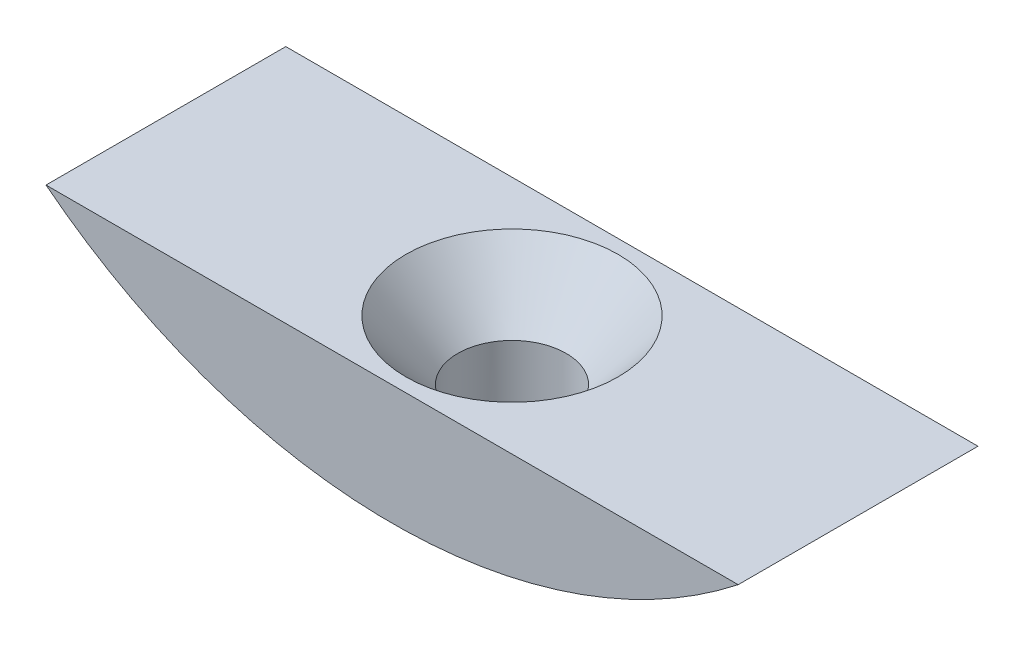
ISO-10303-21;
HEADER;
FILE_DESCRIPTION(('STEP AP214'),'2;1');
FILE_NAME('part.step','',(''),(''),'','','');
FILE_SCHEMA(('AUTOMOTIVE_DESIGN { 1 0 10303 214 1 1 1 1 }'));
ENDSEC;
DATA;
#1=APPLICATION_CONTEXT('core data for automotive mechanical design processes');
#2=APPLICATION_PROTOCOL_DEFINITION('international standard','automotive_design',2000,#1);
#3=PRODUCT_CONTEXT('',#1,'mechanical');
#4=PRODUCT('Part','Part','',(#3));
#5=PRODUCT_RELATED_PRODUCT_CATEGORY('part','',(#4));
#6=PRODUCT_DEFINITION_FORMATION('','',#4);
#7=PRODUCT_DEFINITION_CONTEXT('part definition',#1,'design');
#8=PRODUCT_DEFINITION('design','',#6,#7);
#9=PRODUCT_DEFINITION_SHAPE('','',#8);
#10=(LENGTH_UNIT() NAMED_UNIT(*) SI_UNIT(.MILLI.,.METRE.));
#11=(NAMED_UNIT(*) PLANE_ANGLE_UNIT() SI_UNIT($,.RADIAN.));
#12=(NAMED_UNIT(*) SI_UNIT($,.STERADIAN.) SOLID_ANGLE_UNIT());
#13=UNCERTAINTY_MEASURE_WITH_UNIT(LENGTH_MEASURE(1.E-05),#10,'distance_accuracy_value','');
#14=(GEOMETRIC_REPRESENTATION_CONTEXT(3) GLOBAL_UNCERTAINTY_ASSIGNED_CONTEXT((#13)) GLOBAL_UNIT_ASSIGNED_CONTEXT((#10,
#11,#12)) REPRESENTATION_CONTEXT('',''));
#15=CARTESIAN_POINT('',(0.,0.,0.));
#16=DIRECTION('',(0.,0.,1.));
#17=DIRECTION('',(1.,0.,0.));
#18=AXIS2_PLACEMENT_3D('',#15,#16,#17);
#19=CARTESIAN_POINT('',(0.,17.4625,-9.525));
#20=DIRECTION('',(0.,0.,1.));
#21=DIRECTION('',(1.,0.,0.));
#22=AXIS2_PLACEMENT_3D('',#19,#20,#21);
#23=CYLINDRICAL_SURFACE('',#22,22.225);
#24=CARTESIAN_POINT('',(0.,-4.7625,-2.60985));
#25=CARTESIAN_POINT('',(-0.120612130966112,-4.7624986511756,-2.60985523258769));
#26=CARTESIAN_POINT('',(-0.241304483611949,-4.76150774134481,-2.62002089743118));
#27=CARTESIAN_POINT('',(-0.479344492124389,-4.75765008781758,-2.66042103426531));
#28=CARTESIAN_POINT('',(-0.596688291509832,-4.75478126567536,-2.69067774326365));
#29=CARTESIAN_POINT('',(-0.824549572593585,-4.74749169739673,-2.77037208041914));
#30=CARTESIAN_POINT('',(-0.935071079076204,-4.74307187675653,-2.81979827180237));
#31=CARTESIAN_POINT('',(-1.14622468158864,-4.7331748168945,-2.93640668918681));
#32=CARTESIAN_POINT('',(-1.2468587685692,-4.72769779121483,-3.00358533042542));
#33=CARTESIAN_POINT('',(-1.43574628089262,-4.71627932481685,-3.154036109777));
#34=CARTESIAN_POINT('',(-1.52396153692765,-4.71033653610539,-3.23735607071716));
#35=CARTESIAN_POINT('',(-1.68517932374719,-4.69866751218187,-3.41762249619009));
#36=CARTESIAN_POINT('',(-1.75818115822993,-4.6929412868915,-3.51456958408176));
#37=CARTESIAN_POINT('',(-1.88703394571874,-4.682339828761,-3.71957577390564));
#38=CARTESIAN_POINT('',(-1.94285054071617,-4.67746630899928,-3.82765656710085));
#39=CARTESIAN_POINT('',(-2.03552902073537,-4.66913854199585,-4.05171159221802));
#40=CARTESIAN_POINT('',(-2.07239134689321,-4.66568426172356,-4.16768564036354));
#41=CARTESIAN_POINT('',(-2.12600218918535,-4.66059811150276,-4.40384702778266));
#42=CARTESIAN_POINT('',(-2.14281381310684,-4.65896052481672,-4.52401991582265));
#43=CARTESIAN_POINT('',(-2.15604108469773,-4.6576753693915,-4.76549195782211));
#44=CARTESIAN_POINT('',(-2.1524572373604,-4.65802775138057,-4.88679108382161));
#45=CARTESIAN_POINT('',(-2.12504734145938,-4.6606775027445,-5.12663785925097));
#46=CARTESIAN_POINT('',(-2.10129013300006,-4.66296825747258,-5.24519345912463));
#47=CARTESIAN_POINT('',(-2.03431497539187,-4.66922630351335,-5.47662669338648));
#48=CARTESIAN_POINT('',(-1.9910967780143,-4.6731936162108,-5.58950425532978));
#49=CARTESIAN_POINT('',(-1.88635024194548,-4.68236537493718,-5.80659508445349));
#50=CARTESIAN_POINT('',(-1.82479129179952,-4.68757188629304,-5.91079349077548));
#51=CARTESIAN_POINT('',(-1.68513269326596,-4.69863362236917,-6.10740560057455));
#52=CARTESIAN_POINT('',(-1.60703259089264,-4.7044888648923,-6.1998189804902));
#53=CARTESIAN_POINT('',(-1.4361238473636,-4.71621779170143,-6.37063783688132));
#54=CARTESIAN_POINT('',(-1.34325574186259,-4.72209145217267,-6.44898383167397));
#55=CARTESIAN_POINT('',(-1.14565385674007,-4.73317250621942,-6.58898316219093));
#56=CARTESIAN_POINT('',(-1.04092006503158,-4.73837989911622,-6.65063648091099));
#57=CARTESIAN_POINT('',(-0.822519119398024,-4.74754324375213,-6.75549769560593));
#58=CARTESIAN_POINT('',(-0.708850544841329,-4.75149899597568,-6.79870265123549));
#59=CARTESIAN_POINT('',(-0.475825756919161,-4.7577112711426,-6.86539751064756));
#60=CARTESIAN_POINT('',(-0.356469703189447,-4.75996784174864,-6.88888796743116));
#61=CARTESIAN_POINT('',(-0.115973244558117,-4.76252137778273,-6.91541174019474));
#62=CARTESIAN_POINT('',(0.0051580261346689,-4.76282620718066,-6.9185271525428));
#63=CARTESIAN_POINT('',(0.24621888808831,-4.76146298451555,-6.90442791202026));
#64=CARTESIAN_POINT('',(0.366148494543462,-4.75979495742988,-6.88721351653542));
#65=CARTESIAN_POINT('',(0.601165293707275,-4.75467853240124,-6.83301140915207));
#66=CARTESIAN_POINT('',(0.716261415250627,-4.75123358890785,-6.79606205845648));
#67=CARTESIAN_POINT('',(0.938621438433311,-4.74294991038887,-6.70347827101766));
#68=CARTESIAN_POINT('',(1.04588517474294,-4.7381111459525,-6.64784343999115));
#69=CARTESIAN_POINT('',(1.24990727853601,-4.727561716832,-6.51926381348034));
#70=CARTESIAN_POINT('',(1.34663145358158,-4.72184835095057,-6.44626498873646));
#71=CARTESIAN_POINT('',(1.52648287257634,-4.71019972574066,-6.28510712922744));
#72=CARTESIAN_POINT('',(1.60960979659445,-4.70426446119514,-6.19694773784789));
#73=CARTESIAN_POINT('',(1.76019139885712,-4.69281739516453,-6.00761344912225));
#74=CARTESIAN_POINT('',(1.82759225886451,-4.68730708983234,-5.9063956458189));
#75=CARTESIAN_POINT('',(1.94443869347312,-4.67735629239411,-5.69402975265288));
#76=CARTESIAN_POINT('',(1.99388450041512,-4.67291578644497,-5.58288179131097));
#77=CARTESIAN_POINT('',(2.07332682683613,-4.66561651709244,-5.35399644395983));
#78=CARTESIAN_POINT('',(2.10335555462153,-4.66275513545963,-5.2362703238713));
#79=CARTESIAN_POINT('',(2.14321589570016,-4.65892983578,-4.99741790614215));
#80=CARTESIAN_POINT('',(2.15304804925398,-4.65796586697721,-4.8762916995421));
#81=CARTESIAN_POINT('',(2.15222890350746,-4.65804554062405,-4.63461233264097));
#82=CARTESIAN_POINT('',(2.14166214860485,-4.65908089676677,-4.51405887411888));
#83=CARTESIAN_POINT('',(2.10052220596374,-4.66302490603124,-4.27644810899491));
#84=CARTESIAN_POINT('',(2.06994899392097,-4.66593356142871,-4.15939080664042));
#85=CARTESIAN_POINT('',(1.98968695155854,-4.67329416246757,-3.93209460318923));
#86=CARTESIAN_POINT('',(1.94000041483634,-4.67774592293015,-3.8218548858246));
#87=CARTESIAN_POINT('',(1.8229309801946,-4.68769150253688,-3.61126667452224));
#88=CARTESIAN_POINT('',(1.75554821730167,-4.69318531372984,-3.51091810512062));
#89=CARTESIAN_POINT('',(1.60468140335752,-4.70462322610633,-3.32252747048839));
#90=CARTESIAN_POINT('',(1.52113440434055,-4.71056903064907,-3.23453591763032));
#91=CARTESIAN_POINT('',(1.34043372869884,-4.72222541194928,-3.07378319831726));
#92=CARTESIAN_POINT('',(1.24327679120411,-4.72793593190821,-3.00102569231304));
#93=CARTESIAN_POINT('',(1.03786318385128,-4.73849229965145,-2.87267199017715));
#94=CARTESIAN_POINT('',(0.929580616621992,-4.7433360546251,-2.81711710003487));
#95=CARTESIAN_POINT('',(0.705247196692885,-4.7515900837853,-2.7250514742957));
#96=CARTESIAN_POINT('',(0.58920530631407,-4.75500197976656,-2.68851918140102));
#97=CARTESIAN_POINT('',(0.393750658501181,-4.75914678969574,-2.64468466856141));
#98=CARTESIAN_POINT('',(0.315588933549108,-4.76039840816379,-2.63163941738703));
#99=CARTESIAN_POINT('',(0.158296323462667,-4.76207545440157,-2.6142203823873));
#100=CARTESIAN_POINT('',(0.0791654420225182,-4.76250088531956,-2.60984656551862));
#101=CARTESIAN_POINT('',(0.,-4.7625,-2.60985));
#102=B_SPLINE_CURVE_WITH_KNOTS('',3,(#24,#25,#26,#27,#28,#29,#30,#31,#32,#33,#34,#35,#36,#37,
#38,#39,#40,#41,#42,#43,#44,#45,#46,#47,#48,#49,#50,#51,#52,#53,#54,#55,#56,#57,#58,#59,#60,#61,
#62,#63,#64,#65,#66,#67,#68,#69,#70,#71,#72,#73,#74,#75,#76,#77,#78,#79,#80,#81,#82,#83,#84,#85,
#86,#87,#88,#89,#90,#91,#92,#93,#94,#95,#96,#97,#98,#99,#100,#101),.UNSPECIFIED.,.T.,.F.,(4,2,2,
2,2,2,2,2,2,2,2,2,2,2,2,2,2,2,2,2,2,2,2,2,2,2,2,2,2,2,2,2,2,2,2,2,2,2,4),(0.,0.361547318921501,
0.723495471233829,1.08522801171891,1.44688756308297,1.80963548025924,2.17239999636902,
2.53588513803447,2.89936181967067,3.26169144634603,3.6240121017542,3.98510131046452,
4.34619512506856,4.70789502856011,5.0696048604938,5.43280984585981,5.79601520120848,
6.15927842352853,6.52253145580134,6.88431994036334,7.24610384454721,7.6071870516985,
7.96827787856361,8.33050731061719,8.69274526437787,9.05620527004833,9.41966057233039,
9.78251143172536,10.1453525846934,10.506693150603,10.8680341554776,11.2293318129798,
11.590626713771,11.9533579947192,12.3161763333051,12.6798592145412,13.0431290513829,
13.2804365440281,13.5177431323888),.UNSPECIFIED.);
#103=CARTESIAN_POINT('',(0.,-4.7625,-2.60985));
#104=VERTEX_POINT('',#103);
#105=EDGE_CURVE('E11',#104,#104,#102,.T.);
#106=ORIENTED_EDGE('',*,*,#105,.F.);
#107=EDGE_LOOP('',(#106));
#108=FACE_BOUND('',#107,.T.);
#109=CARTESIAN_POINT('',(0.,17.4625,0.));
#110=DIRECTION('',(0.,0.,1.));
#111=DIRECTION('',(1.,0.,0.));
#112=AXIS2_PLACEMENT_3D('',#109,#110,#111);
#113=CIRCLE('',#112,22.225);
#114=CARTESIAN_POINT('',(-13.748153285078,0.,0.));
#115=VERTEX_POINT('',#114);
#116=CARTESIAN_POINT('',(13.748153285078,0.,0.));
#117=VERTEX_POINT('',#116);
#118=EDGE_CURVE('E70',#115,#117,#113,.T.);
#119=ORIENTED_EDGE('',*,*,#118,.F.);
#120=DIRECTION('',(0.,0.,1.));
#121=VECTOR('',#120,1.);
#122=CARTESIAN_POINT('',(-13.748153285078,0.,-9.525));
#123=LINE('',#122,#121);
#124=CARTESIAN_POINT('',(-13.748153285078,0.,-9.525));
#125=VERTEX_POINT('',#124);
#126=EDGE_CURVE('E46',#125,#115,#123,.T.);
#127=ORIENTED_EDGE('',*,*,#126,.F.);
#128=CARTESIAN_POINT('',(0.,17.4625,-9.525));
#129=DIRECTION('',(0.,0.,1.));
#130=DIRECTION('',(1.,0.,0.));
#131=AXIS2_PLACEMENT_3D('',#128,#129,#130);
#132=CIRCLE('',#131,22.225);
#133=CARTESIAN_POINT('',(13.748153285078,0.,-9.525));
#134=VERTEX_POINT('',#133);
#135=EDGE_CURVE('E75',#125,#134,#132,.T.);
#136=ORIENTED_EDGE('',*,*,#135,.T.);
#137=DIRECTION('',(0.,0.,1.));
#138=VECTOR('',#137,1.);
#139=CARTESIAN_POINT('',(13.748153285078,0.,-9.525));
#140=LINE('',#139,#138);
#141=EDGE_CURVE('E59',#134,#117,#140,.T.);
#142=ORIENTED_EDGE('',*,*,#141,.T.);
#143=EDGE_LOOP('',(#119,#127,#136,#142));
#144=FACE_BOUND('',#143,.T.);
#145=ADVANCED_FACE('F33',(#108,#144),#23,.T.);
#146=CARTESIAN_POINT('',(-13.748153285078,0.,-9.525));
#147=DIRECTION('',(0.,1.,0.));
#148=DIRECTION('',(-1.,0.,0.));
#149=AXIS2_PLACEMENT_3D('',#146,#147,#148);
#150=PLANE('',#149);
#151=CARTESIAN_POINT('',(0.,0.,-4.7625));
#152=DIRECTION('',(0.,1.,0.));
#153=DIRECTION('',(0.,0.,1.));
#154=AXIS2_PLACEMENT_3D('',#151,#152,#153);
#155=CIRCLE('',#154,4.2164);
#156=CARTESIAN_POINT('',(0.,0.,-0.546099999999999));
#157=VERTEX_POINT('',#156);
#158=EDGE_CURVE('E82',#157,#157,#155,.T.);
#159=ORIENTED_EDGE('',*,*,#158,.F.);
#160=EDGE_LOOP('',(#159));
#161=FACE_BOUND('',#160,.T.);
#162=DIRECTION('',(-1.,0.,0.));
#163=VECTOR('',#162,1.);
#164=CARTESIAN_POINT('',(-13.748153285078,0.,0.));
#165=LINE('',#164,#163);
#166=EDGE_CURVE('E66',#117,#115,#165,.T.);
#167=ORIENTED_EDGE('',*,*,#166,.F.);
#168=ORIENTED_EDGE('',*,*,#141,.F.);
#169=DIRECTION('',(-1.,0.,0.));
#170=VECTOR('',#169,1.);
#171=CARTESIAN_POINT('',(-13.748153285078,0.,-9.525));
#172=LINE('',#171,#170);
#173=EDGE_CURVE('E68',#134,#125,#172,.T.);
#174=ORIENTED_EDGE('',*,*,#173,.T.);
#175=ORIENTED_EDGE('',*,*,#126,.T.);
#176=EDGE_LOOP('',(#167,#168,#174,#175));
#177=FACE_BOUND('',#176,.T.);
#178=ADVANCED_FACE('F64',(#161,#177),#150,.T.);
#179=CARTESIAN_POINT('',(0.,17.4625,-9.525));
#180=DIRECTION('',(0.,0.,1.));
#181=DIRECTION('',(1.,0.,0.));
#182=AXIS2_PLACEMENT_3D('',#179,#180,#181);
#183=PLANE('',#182);
#184=ORIENTED_EDGE('',*,*,#135,.F.);
#185=ORIENTED_EDGE('',*,*,#173,.F.);
#186=EDGE_LOOP('',(#184,#185));
#187=FACE_BOUND('',#186,.T.);
#188=ADVANCED_FACE('F89',(#187),#183,.F.);
#189=CARTESIAN_POINT('',(0.,17.4625,0.));
#190=DIRECTION('',(0.,0.,1.));
#191=DIRECTION('',(1.,0.,0.));
#192=AXIS2_PLACEMENT_3D('',#189,#190,#191);
#193=PLANE('',#192);
#194=ORIENTED_EDGE('',*,*,#118,.T.);
#195=ORIENTED_EDGE('',*,*,#166,.T.);
#196=EDGE_LOOP('',(#194,#195));
#197=FACE_BOUND('',#196,.T.);
#198=ADVANCED_FACE('F74',(#197),#193,.T.);
#199=CARTESIAN_POINT('',(0.,0.,-4.7625));
#200=DIRECTION('',(0.,1.,0.));
#201=DIRECTION('',(0.,0.,1.));
#202=AXIS2_PLACEMENT_3D('',#199,#200,#201);
#203=CYLINDRICAL_SURFACE('',#202,2.15265);
#204=ORIENTED_EDGE('',*,*,#105,.T.);
#205=EDGE_LOOP('',(#204));
#206=FACE_BOUND('',#205,.T.);
#207=CARTESIAN_POINT('',(0.,-2.37407280040236,-4.7625));
#208=DIRECTION('',(0.,1.,0.));
#209=DIRECTION('',(0.,0.,1.));
#210=AXIS2_PLACEMENT_3D('',#207,#208,#209);
#211=CIRCLE('',#210,2.15265);
#212=CARTESIAN_POINT('',(0.,-2.37407280040236,-2.60985));
#213=VERTEX_POINT('',#212);
#214=EDGE_CURVE('E72',#213,#213,#211,.T.);
#215=ORIENTED_EDGE('',*,*,#214,.T.);
#216=EDGE_LOOP('',(#215));
#217=FACE_BOUND('',#216,.T.);
#218=ADVANCED_FACE('F99',(#206,#217),#203,.F.);
#219=CARTESIAN_POINT('',(0.,0.,-4.7625));
#220=DIRECTION('',(0.,1.,0.));
#221=DIRECTION('',(0.,0.,1.));
#222=AXIS2_PLACEMENT_3D('',#219,#220,#221);
#223=CONICAL_SURFACE('',#222,4.2164,0.715584993317675);
#224=ORIENTED_EDGE('',*,*,#214,.F.);
#225=EDGE_LOOP('',(#224));
#226=FACE_BOUND('',#225,.T.);
#227=ORIENTED_EDGE('',*,*,#158,.T.);
#228=EDGE_LOOP('',(#227));
#229=FACE_BOUND('',#228,.T.);
#230=ADVANCED_FACE('F86',(#226,#229),#223,.F.);
#231=CLOSED_SHELL('',(#145,#178,#188,#198,#218,#230));
#232=MANIFOLD_SOLID_BREP('B2',#231);
#233=ADVANCED_BREP_SHAPE_REPRESENTATION('',(#18,#232),#14);
#234=SHAPE_DEFINITION_REPRESENTATION(#9,#233);
ENDSEC;
END-ISO-10303-21;
